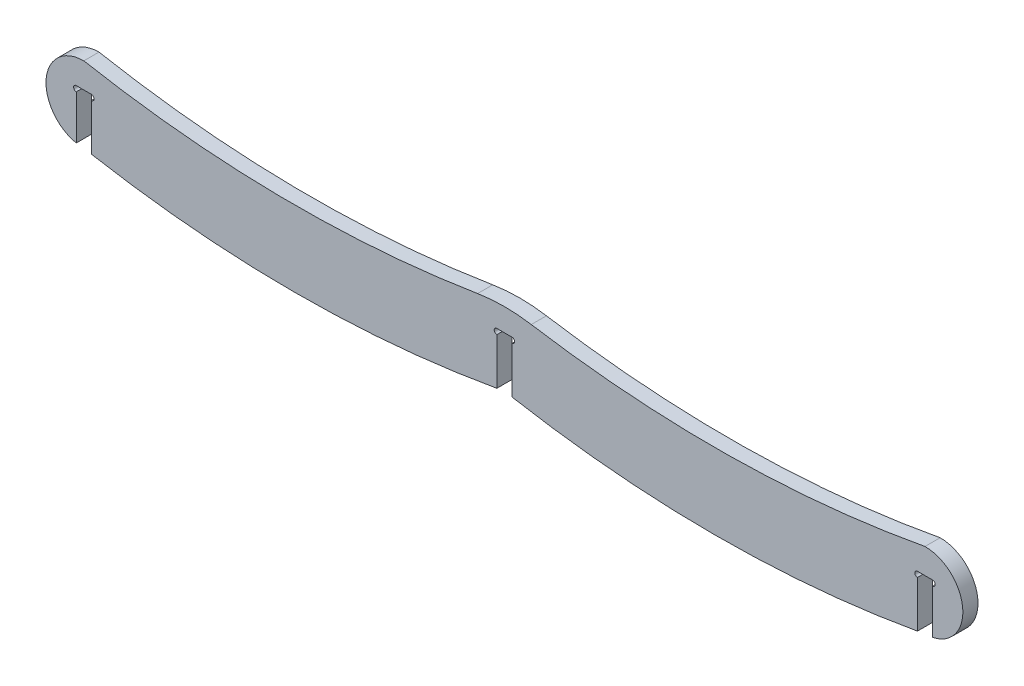
ISO-10303-21;
HEADER;
FILE_DESCRIPTION(('STEP AP214'),'2;1');
FILE_NAME('part.step','',(''),(''),'','','');
FILE_SCHEMA(('AUTOMOTIVE_DESIGN { 1 0 10303 214 1 1 1 1 }'));
ENDSEC;
DATA;
#1=APPLICATION_CONTEXT('core data for automotive mechanical design processes');
#2=APPLICATION_PROTOCOL_DEFINITION('international standard','automotive_design',2000,#1);
#3=PRODUCT_CONTEXT('',#1,'mechanical');
#4=PRODUCT('Part','Part','',(#3));
#5=PRODUCT_RELATED_PRODUCT_CATEGORY('part','',(#4));
#6=PRODUCT_DEFINITION_FORMATION('','',#4);
#7=PRODUCT_DEFINITION_CONTEXT('part definition',#1,'design');
#8=PRODUCT_DEFINITION('design','',#6,#7);
#9=PRODUCT_DEFINITION_SHAPE('','',#8);
#10=(LENGTH_UNIT() NAMED_UNIT(*) SI_UNIT(.MILLI.,.METRE.));
#11=(NAMED_UNIT(*) PLANE_ANGLE_UNIT() SI_UNIT($,.RADIAN.));
#12=(NAMED_UNIT(*) SI_UNIT($,.STERADIAN.) SOLID_ANGLE_UNIT());
#13=UNCERTAINTY_MEASURE_WITH_UNIT(LENGTH_MEASURE(1.E-05),#10,'distance_accuracy_value','');
#14=(GEOMETRIC_REPRESENTATION_CONTEXT(3) GLOBAL_UNCERTAINTY_ASSIGNED_CONTEXT((#13)) GLOBAL_UNIT_ASSIGNED_CONTEXT((#10,
#11,#12)) REPRESENTATION_CONTEXT('',''));
#15=CARTESIAN_POINT('',(0.,0.,0.));
#16=DIRECTION('',(0.,0.,1.));
#17=DIRECTION('',(1.,0.,0.));
#18=AXIS2_PLACEMENT_3D('',#15,#16,#17);
#19=CARTESIAN_POINT('',(192.011086170743,1434.09067760014,18.));
#20=DIRECTION('',(0.,0.,-1.));
#21=DIRECTION('',(-1.,0.,0.));
#22=AXIS2_PLACEMENT_3D('',#19,#20,#21);
#23=CYLINDRICAL_SURFACE('',#22,1367.14291484526);
#24=CARTESIAN_POINT('',(192.011086170743,1434.09067760014,18.));
#25=DIRECTION('',(0.,0.,1.));
#26=DIRECTION('',(1.,0.,0.));
#27=AXIS2_PLACEMENT_3D('',#24,#25,#26);
#28=CIRCLE('',#27,1367.14291484526);
#29=CARTESIAN_POINT('',(-57.9889138292563,90.,18.));
#30=VERTEX_POINT('',#29);
#31=CARTESIAN_POINT('',(410.105891356436,84.4557619423469,18.));
#32=VERTEX_POINT('',#31);
#33=EDGE_CURVE('E186',#30,#32,#28,.T.);
#34=ORIENTED_EDGE('',*,*,#33,.T.);
#35=DIRECTION('',(0.,0.,-1.));
#36=VECTOR('',#35,1.);
#37=CARTESIAN_POINT('',(410.105891356436,84.4557619423467,18.));
#38=LINE('',#37,#36);
#39=CARTESIAN_POINT('',(410.105891356436,84.4557619423469,0.));
#40=VERTEX_POINT('',#39);
#41=EDGE_CURVE('E192',#32,#40,#38,.T.);
#42=ORIENTED_EDGE('',*,*,#41,.T.);
#43=CARTESIAN_POINT('',(192.011086170743,1434.09067760014,0.));
#44=DIRECTION('',(0.,0.,1.));
#45=DIRECTION('',(1.,0.,0.));
#46=AXIS2_PLACEMENT_3D('',#43,#44,#45);
#47=CIRCLE('',#46,1367.14291484526);
#48=CARTESIAN_POINT('',(-57.9889138292563,90.,0.));
#49=VERTEX_POINT('',#48);
#50=EDGE_CURVE('E188',#49,#40,#47,.T.);
#51=ORIENTED_EDGE('',*,*,#50,.F.);
#52=DIRECTION('',(0.,0.,-1.));
#53=VECTOR('',#52,1.);
#54=CARTESIAN_POINT('',(-57.9889138292563,90.,18.));
#55=LINE('',#54,#53);
#56=EDGE_CURVE('E182',#30,#49,#55,.T.);
#57=ORIENTED_EDGE('',*,*,#56,.F.);
#58=EDGE_LOOP('',(#34,#42,#51,#57));
#59=FACE_BOUND('',#58,.T.);
#60=ADVANCED_FACE('F35',(#59),#23,.F.);
#61=CARTESIAN_POINT('',(-57.9889138292565,45.,18.));
#62=DIRECTION('',(0.,0.,-1.));
#63=DIRECTION('',(-1.,0.,0.));
#64=AXIS2_PLACEMENT_3D('',#61,#62,#63);
#65=CYLINDRICAL_SURFACE('',#64,45.);
#66=CARTESIAN_POINT('',(-57.9889138292565,45.,0.));
#67=DIRECTION('',(0.,0.,1.));
#68=DIRECTION('',(1.,0.,0.));
#69=AXIS2_PLACEMENT_3D('',#66,#67,#68);
#70=CIRCLE('',#69,45.);
#71=CARTESIAN_POINT('',(-66.9889138292565,0.909184629902797,0.));
#72=VERTEX_POINT('',#71);
#73=EDGE_CURVE('E258',#49,#72,#70,.T.);
#74=ORIENTED_EDGE('',*,*,#73,.T.);
#75=DIRECTION('',(0.,0.,-1.));
#76=VECTOR('',#75,1.);
#77=CARTESIAN_POINT('',(-66.9889138292565,0.909184629902797,18.));
#78=LINE('',#77,#76);
#79=CARTESIAN_POINT('',(-66.9889138292565,0.909184629902797,18.));
#80=VERTEX_POINT('',#79);
#81=EDGE_CURVE('E193',#80,#72,#78,.T.);
#82=ORIENTED_EDGE('',*,*,#81,.F.);
#83=CARTESIAN_POINT('',(-57.9889138292565,45.,18.));
#84=DIRECTION('',(0.,0.,1.));
#85=DIRECTION('',(1.,0.,0.));
#86=AXIS2_PLACEMENT_3D('',#83,#84,#85);
#87=CIRCLE('',#86,45.);
#88=EDGE_CURVE('E196',#30,#80,#87,.T.);
#89=ORIENTED_EDGE('',*,*,#88,.F.);
#90=ORIENTED_EDGE('',*,*,#56,.T.);
#91=EDGE_LOOP('',(#74,#82,#89,#90));
#92=FACE_BOUND('',#91,.T.);
#93=ADVANCED_FACE('F197',(#92),#65,.T.);
#94=CARTESIAN_POINT('',(-66.9889138292565,0.,18.));
#95=DIRECTION('',(1.,0.,0.));
#96=DIRECTION('',(0.,0.,-1.));
#97=AXIS2_PLACEMENT_3D('',#94,#95,#96);
#98=PLANE('',#97);
#99=DIRECTION('',(0.,-1.,0.));
#100=VECTOR('',#99,1.);
#101=CARTESIAN_POINT('',(-66.9889138292565,0.,0.));
#102=LINE('',#101,#100);
#103=CARTESIAN_POINT('',(-66.9889138292565,53.65,0.));
#104=VERTEX_POINT('',#103);
#105=EDGE_CURVE('E260',#104,#72,#102,.T.);
#106=ORIENTED_EDGE('',*,*,#105,.F.);
#107=DIRECTION('',(0.,0.,-1.));
#108=VECTOR('',#107,1.);
#109=CARTESIAN_POINT('',(-66.9889138292565,53.65,18.));
#110=LINE('',#109,#108);
#111=CARTESIAN_POINT('',(-66.9889138292565,53.65,18.));
#112=VERTEX_POINT('',#111);
#113=EDGE_CURVE('E347',#112,#104,#110,.T.);
#114=ORIENTED_EDGE('',*,*,#113,.F.);
#115=DIRECTION('',(0.,-1.,0.));
#116=VECTOR('',#115,1.);
#117=CARTESIAN_POINT('',(-66.9889138292565,0.,18.));
#118=LINE('',#117,#116);
#119=EDGE_CURVE('E201',#112,#80,#118,.T.);
#120=ORIENTED_EDGE('',*,*,#119,.T.);
#121=ORIENTED_EDGE('',*,*,#81,.T.);
#122=EDGE_LOOP('',(#106,#114,#120,#121));
#123=FACE_BOUND('',#122,.T.);
#124=ADVANCED_FACE('F357',(#123),#98,.T.);
#125=CARTESIAN_POINT('',(-66.9889138292565,56.825,18.));
#126=DIRECTION('',(0.,0.,-1.));
#127=DIRECTION('',(-1.,0.,0.));
#128=AXIS2_PLACEMENT_3D('',#125,#126,#127);
#129=CYLINDRICAL_SURFACE('',#128,3.175);
#130=CARTESIAN_POINT('',(-66.9889138292565,56.825,0.));
#131=DIRECTION('',(0.,0.,1.));
#132=DIRECTION('',(1.,0.,0.));
#133=AXIS2_PLACEMENT_3D('',#130,#131,#132);
#134=CIRCLE('',#133,3.175);
#135=CARTESIAN_POINT('',(-66.9889138292565,60.,0.));
#136=VERTEX_POINT('',#135);
#137=EDGE_CURVE('E263',#136,#104,#134,.T.);
#138=ORIENTED_EDGE('',*,*,#137,.F.);
#139=DIRECTION('',(0.,0.,-1.));
#140=VECTOR('',#139,1.);
#141=CARTESIAN_POINT('',(-66.9889138292565,60.,18.));
#142=LINE('',#141,#140);
#143=CARTESIAN_POINT('',(-66.9889138292565,60.,18.));
#144=VERTEX_POINT('',#143);
#145=EDGE_CURVE('E345',#144,#136,#142,.T.);
#146=ORIENTED_EDGE('',*,*,#145,.F.);
#147=CARTESIAN_POINT('',(-66.9889138292565,56.825,18.));
#148=DIRECTION('',(0.,0.,1.));
#149=DIRECTION('',(1.,0.,0.));
#150=AXIS2_PLACEMENT_3D('',#147,#148,#149);
#151=CIRCLE('',#150,3.175);
#152=EDGE_CURVE('E211',#144,#112,#151,.T.);
#153=ORIENTED_EDGE('',*,*,#152,.T.);
#154=ORIENTED_EDGE('',*,*,#113,.T.);
#155=EDGE_LOOP('',(#138,#146,#153,#154));
#156=FACE_BOUND('',#155,.T.);
#157=ADVANCED_FACE('F360',(#156),#129,.F.);
#158=CARTESIAN_POINT('',(0.,60.,18.));
#159=DIRECTION('',(0.,1.,0.));
#160=DIRECTION('',(0.,0.,1.));
#161=AXIS2_PLACEMENT_3D('',#158,#159,#160);
#162=PLANE('',#161);
#163=DIRECTION('',(1.,0.,0.));
#164=VECTOR('',#163,1.);
#165=CARTESIAN_POINT('',(0.,60.,0.));
#166=LINE('',#165,#164);
#167=CARTESIAN_POINT('',(-48.9889138292565,60.,0.));
#168=VERTEX_POINT('',#167);
#169=EDGE_CURVE('E266',#136,#168,#166,.T.);
#170=ORIENTED_EDGE('',*,*,#169,.T.);
#171=DIRECTION('',(0.,0.,-1.));
#172=VECTOR('',#171,1.);
#173=CARTESIAN_POINT('',(-48.9889138292565,60.,18.));
#174=LINE('',#173,#172);
#175=CARTESIAN_POINT('',(-48.9889138292565,60.,18.));
#176=VERTEX_POINT('',#175);
#177=EDGE_CURVE('E343',#176,#168,#174,.T.);
#178=ORIENTED_EDGE('',*,*,#177,.F.);
#179=DIRECTION('',(1.,0.,0.));
#180=VECTOR('',#179,1.);
#181=CARTESIAN_POINT('',(0.,60.,18.));
#182=LINE('',#181,#180);
#183=EDGE_CURVE('E214',#144,#176,#182,.T.);
#184=ORIENTED_EDGE('',*,*,#183,.F.);
#185=ORIENTED_EDGE('',*,*,#145,.T.);
#186=EDGE_LOOP('',(#170,#178,#184,#185));
#187=FACE_BOUND('',#186,.T.);
#188=ADVANCED_FACE('F364',(#187),#162,.F.);
#189=CARTESIAN_POINT('',(-48.9889138292565,56.825,18.));
#190=DIRECTION('',(0.,0.,-1.));
#191=DIRECTION('',(-1.,0.,0.));
#192=AXIS2_PLACEMENT_3D('',#189,#190,#191);
#193=CYLINDRICAL_SURFACE('',#192,3.175);
#194=CARTESIAN_POINT('',(-48.9889138292565,56.825,0.));
#195=DIRECTION('',(0.,0.,1.));
#196=DIRECTION('',(1.,0.,0.));
#197=AXIS2_PLACEMENT_3D('',#194,#195,#196);
#198=CIRCLE('',#197,3.175);
#199=CARTESIAN_POINT('',(-48.9889138292565,53.65,0.));
#200=VERTEX_POINT('',#199);
#201=EDGE_CURVE('E269',#200,#168,#198,.T.);
#202=ORIENTED_EDGE('',*,*,#201,.F.);
#203=DIRECTION('',(0.,0.,-1.));
#204=VECTOR('',#203,1.);
#205=CARTESIAN_POINT('',(-48.9889138292565,53.65,18.));
#206=LINE('',#205,#204);
#207=CARTESIAN_POINT('',(-48.9889138292565,53.65,18.));
#208=VERTEX_POINT('',#207);
#209=EDGE_CURVE('E341',#208,#200,#206,.T.);
#210=ORIENTED_EDGE('',*,*,#209,.F.);
#211=CARTESIAN_POINT('',(-48.9889138292565,56.825,18.));
#212=DIRECTION('',(0.,0.,1.));
#213=DIRECTION('',(1.,0.,0.));
#214=AXIS2_PLACEMENT_3D('',#211,#212,#213);
#215=CIRCLE('',#214,3.175);
#216=EDGE_CURVE('E216',#208,#176,#215,.T.);
#217=ORIENTED_EDGE('',*,*,#216,.T.);
#218=ORIENTED_EDGE('',*,*,#177,.T.);
#219=EDGE_LOOP('',(#202,#210,#217,#218));
#220=FACE_BOUND('',#219,.T.);
#221=ADVANCED_FACE('F370',(#220),#193,.F.);
#222=CARTESIAN_POINT('',(-48.9889138292565,0.,18.));
#223=DIRECTION('',(1.,0.,0.));
#224=DIRECTION('',(0.,0.,-1.));
#225=AXIS2_PLACEMENT_3D('',#222,#223,#224);
#226=PLANE('',#225);
#227=DIRECTION('',(0.,-1.,0.));
#228=VECTOR('',#227,1.);
#229=CARTESIAN_POINT('',(-48.9889138292565,0.,0.));
#230=LINE('',#229,#228);
#231=CARTESIAN_POINT('',(-48.9889138292565,-1.6428582871113,0.));
#232=VERTEX_POINT('',#231);
#233=EDGE_CURVE('E272',#200,#232,#230,.T.);
#234=ORIENTED_EDGE('',*,*,#233,.T.);
#235=DIRECTION('',(0.,0.,-1.));
#236=VECTOR('',#235,1.);
#237=CARTESIAN_POINT('',(-48.9889138292565,-1.6428582871113,18.));
#238=LINE('',#237,#236);
#239=CARTESIAN_POINT('',(-48.9889138292565,-1.6428582871113,18.));
#240=VERTEX_POINT('',#239);
#241=EDGE_CURVE('E338',#240,#232,#238,.T.);
#242=ORIENTED_EDGE('',*,*,#241,.F.);
#243=DIRECTION('',(0.,-1.,0.));
#244=VECTOR('',#243,1.);
#245=CARTESIAN_POINT('',(-48.9889138292565,0.,18.));
#246=LINE('',#245,#244);
#247=EDGE_CURVE('E219',#208,#240,#246,.T.);
#248=ORIENTED_EDGE('',*,*,#247,.F.);
#249=ORIENTED_EDGE('',*,*,#209,.T.);
#250=EDGE_LOOP('',(#234,#242,#248,#249));
#251=FACE_BOUND('',#250,.T.);
#252=ADVANCED_FACE('F373',(#251),#226,.F.);
#253=CARTESIAN_POINT('',(192.011086170743,1344.09067760014,18.));
#254=DIRECTION('',(0.,0.,-1.));
#255=DIRECTION('',(-1.,0.,0.));
#256=AXIS2_PLACEMENT_3D('',#253,#254,#255);
#257=CYLINDRICAL_SURFACE('',#256,1367.14291484526);
#258=CARTESIAN_POINT('',(192.011086170743,1344.09067760014,0.));
#259=DIRECTION('',(0.,0.,1.));
#260=DIRECTION('',(1.,0.,0.));
#261=AXIS2_PLACEMENT_3D('',#258,#259,#260);
#262=CIRCLE('',#261,1367.14291484526);
#263=CARTESIAN_POINT('',(433.011086170744,-1.6428582871113,0.));
#264=VERTEX_POINT('',#263);
#265=EDGE_CURVE('E274',#232,#264,#262,.T.);
#266=ORIENTED_EDGE('',*,*,#265,.T.);
#267=DIRECTION('',(0.,0.,-1.));
#268=VECTOR('',#267,1.);
#269=CARTESIAN_POINT('',(433.011086170744,-1.6428582871113,18.));
#270=LINE('',#269,#268);
#271=CARTESIAN_POINT('',(433.011086170744,-1.6428582871113,18.));
#272=VERTEX_POINT('',#271);
#273=EDGE_CURVE('E336',#272,#264,#270,.T.);
#274=ORIENTED_EDGE('',*,*,#273,.F.);
#275=CARTESIAN_POINT('',(192.011086170743,1344.09067760014,18.));
#276=DIRECTION('',(0.,0.,1.));
#277=DIRECTION('',(1.,0.,0.));
#278=AXIS2_PLACEMENT_3D('',#275,#276,#277);
#279=CIRCLE('',#278,1367.14291484526);
#280=EDGE_CURVE('E221',#240,#272,#279,.T.);
#281=ORIENTED_EDGE('',*,*,#280,.F.);
#282=ORIENTED_EDGE('',*,*,#241,.T.);
#283=EDGE_LOOP('',(#266,#274,#281,#282));
#284=FACE_BOUND('',#283,.T.);
#285=ADVANCED_FACE('F378',(#284),#257,.T.);
#286=CARTESIAN_POINT('',(433.011086170744,0.,18.));
#287=DIRECTION('',(1.,0.,0.));
#288=DIRECTION('',(0.,0.,-1.));
#289=AXIS2_PLACEMENT_3D('',#286,#287,#288);
#290=PLANE('',#289);
#291=DIRECTION('',(0.,-1.,0.));
#292=VECTOR('',#291,1.);
#293=CARTESIAN_POINT('',(433.011086170744,0.,0.));
#294=LINE('',#293,#292);
#295=CARTESIAN_POINT('',(433.011086170744,53.6500000000001,0.));
#296=VERTEX_POINT('',#295);
#297=EDGE_CURVE('E277',#296,#264,#294,.T.);
#298=ORIENTED_EDGE('',*,*,#297,.F.);
#299=DIRECTION('',(0.,0.,-1.));
#300=VECTOR('',#299,1.);
#301=CARTESIAN_POINT('',(433.011086170744,53.6500000000001,18.));
#302=LINE('',#301,#300);
#303=CARTESIAN_POINT('',(433.011086170744,53.6500000000001,18.));
#304=VERTEX_POINT('',#303);
#305=EDGE_CURVE('E334',#304,#296,#302,.T.);
#306=ORIENTED_EDGE('',*,*,#305,.F.);
#307=DIRECTION('',(0.,-1.,0.));
#308=VECTOR('',#307,1.);
#309=CARTESIAN_POINT('',(433.011086170744,0.,18.));
#310=LINE('',#309,#308);
#311=EDGE_CURVE('E223',#304,#272,#310,.T.);
#312=ORIENTED_EDGE('',*,*,#311,.T.);
#313=ORIENTED_EDGE('',*,*,#273,.T.);
#314=EDGE_LOOP('',(#298,#306,#312,#313));
#315=FACE_BOUND('',#314,.T.);
#316=ADVANCED_FACE('F454',(#315),#290,.T.);
#317=CARTESIAN_POINT('',(433.011086170744,56.8250000000001,18.));
#318=DIRECTION('',(0.,0.,-1.));
#319=DIRECTION('',(-1.,0.,0.));
#320=AXIS2_PLACEMENT_3D('',#317,#318,#319);
#321=CYLINDRICAL_SURFACE('',#320,3.175);
#322=CARTESIAN_POINT('',(433.011086170744,56.8250000000001,0.));
#323=DIRECTION('',(0.,0.,1.));
#324=DIRECTION('',(1.,0.,0.));
#325=AXIS2_PLACEMENT_3D('',#322,#323,#324);
#326=CIRCLE('',#325,3.175);
#327=CARTESIAN_POINT('',(433.011086170744,60.0000000000001,0.));
#328=VERTEX_POINT('',#327);
#329=EDGE_CURVE('E280',#328,#296,#326,.T.);
#330=ORIENTED_EDGE('',*,*,#329,.F.);
#331=DIRECTION('',(0.,0.,-1.));
#332=VECTOR('',#331,1.);
#333=CARTESIAN_POINT('',(433.011086170744,60.0000000000001,18.));
#334=LINE('',#333,#332);
#335=CARTESIAN_POINT('',(433.011086170744,60.0000000000001,18.));
#336=VERTEX_POINT('',#335);
#337=EDGE_CURVE('E332',#336,#328,#334,.T.);
#338=ORIENTED_EDGE('',*,*,#337,.F.);
#339=CARTESIAN_POINT('',(433.011086170744,56.8250000000001,18.));
#340=DIRECTION('',(0.,0.,1.));
#341=DIRECTION('',(1.,0.,0.));
#342=AXIS2_PLACEMENT_3D('',#339,#340,#341);
#343=CIRCLE('',#342,3.175);
#344=EDGE_CURVE('E226',#336,#304,#343,.T.);
#345=ORIENTED_EDGE('',*,*,#344,.T.);
#346=ORIENTED_EDGE('',*,*,#305,.T.);
#347=EDGE_LOOP('',(#330,#338,#345,#346));
#348=FACE_BOUND('',#347,.T.);
#349=ADVANCED_FACE('F384',(#348),#321,.F.);
#350=CARTESIAN_POINT('',(0.,60.0000000000001,18.));
#351=DIRECTION('',(0.,1.,0.));
#352=DIRECTION('',(0.,0.,1.));
#353=AXIS2_PLACEMENT_3D('',#350,#351,#352);
#354=PLANE('',#353);
#355=DIRECTION('',(1.,0.,0.));
#356=VECTOR('',#355,1.);
#357=CARTESIAN_POINT('',(0.,60.0000000000001,0.));
#358=LINE('',#357,#356);
#359=CARTESIAN_POINT('',(451.011086170743,60.0000000000001,0.));
#360=VERTEX_POINT('',#359);
#361=EDGE_CURVE('E283',#328,#360,#358,.T.);
#362=ORIENTED_EDGE('',*,*,#361,.T.);
#363=DIRECTION('',(0.,0.,-1.));
#364=VECTOR('',#363,1.);
#365=CARTESIAN_POINT('',(451.011086170743,60.0000000000001,18.));
#366=LINE('',#365,#364);
#367=CARTESIAN_POINT('',(451.011086170743,60.0000000000001,18.));
#368=VERTEX_POINT('',#367);
#369=EDGE_CURVE('E330',#368,#360,#366,.T.);
#370=ORIENTED_EDGE('',*,*,#369,.F.);
#371=DIRECTION('',(1.,0.,0.));
#372=VECTOR('',#371,1.);
#373=CARTESIAN_POINT('',(0.,60.0000000000001,18.));
#374=LINE('',#373,#372);
#375=EDGE_CURVE('E229',#336,#368,#374,.T.);
#376=ORIENTED_EDGE('',*,*,#375,.F.);
#377=ORIENTED_EDGE('',*,*,#337,.T.);
#378=EDGE_LOOP('',(#362,#370,#376,#377));
#379=FACE_BOUND('',#378,.T.);
#380=ADVANCED_FACE('F390',(#379),#354,.F.);
#381=CARTESIAN_POINT('',(451.011086170743,56.8250000000001,18.));
#382=DIRECTION('',(0.,0.,-1.));
#383=DIRECTION('',(-1.,0.,0.));
#384=AXIS2_PLACEMENT_3D('',#381,#382,#383);
#385=CYLINDRICAL_SURFACE('',#384,3.175);
#386=CARTESIAN_POINT('',(451.011086170743,56.8250000000001,0.));
#387=DIRECTION('',(0.,0.,1.));
#388=DIRECTION('',(1.,0.,0.));
#389=AXIS2_PLACEMENT_3D('',#386,#387,#388);
#390=CIRCLE('',#389,3.175);
#391=CARTESIAN_POINT('',(451.011086170743,53.6500000000001,0.));
#392=VERTEX_POINT('',#391);
#393=EDGE_CURVE('E286',#392,#360,#390,.T.);
#394=ORIENTED_EDGE('',*,*,#393,.F.);
#395=DIRECTION('',(0.,0.,-1.));
#396=VECTOR('',#395,1.);
#397=CARTESIAN_POINT('',(451.011086170743,53.6500000000001,18.));
#398=LINE('',#397,#396);
#399=CARTESIAN_POINT('',(451.011086170743,53.6500000000001,18.));
#400=VERTEX_POINT('',#399);
#401=EDGE_CURVE('E328',#400,#392,#398,.T.);
#402=ORIENTED_EDGE('',*,*,#401,.F.);
#403=CARTESIAN_POINT('',(451.011086170743,56.8250000000001,18.));
#404=DIRECTION('',(0.,0.,1.));
#405=DIRECTION('',(1.,0.,0.));
#406=AXIS2_PLACEMENT_3D('',#403,#404,#405);
#407=CIRCLE('',#406,3.175);
#408=EDGE_CURVE('E231',#400,#368,#407,.T.);
#409=ORIENTED_EDGE('',*,*,#408,.T.);
#410=ORIENTED_EDGE('',*,*,#369,.T.);
#411=EDGE_LOOP('',(#394,#402,#409,#410));
#412=FACE_BOUND('',#411,.T.);
#413=ADVANCED_FACE('F396',(#412),#385,.F.);
#414=CARTESIAN_POINT('',(451.011086170743,0.,18.));
#415=DIRECTION('',(1.,0.,0.));
#416=DIRECTION('',(0.,0.,-1.));
#417=AXIS2_PLACEMENT_3D('',#414,#415,#416);
#418=PLANE('',#417);
#419=DIRECTION('',(0.,-1.,0.));
#420=VECTOR('',#419,1.);
#421=CARTESIAN_POINT('',(451.011086170743,0.,0.));
#422=LINE('',#421,#420);
#423=CARTESIAN_POINT('',(451.011086170743,-1.6428582871113,0.));
#424=VERTEX_POINT('',#423);
#425=EDGE_CURVE('E289',#392,#424,#422,.T.);
#426=ORIENTED_EDGE('',*,*,#425,.T.);
#427=DIRECTION('',(0.,0.,-1.));
#428=VECTOR('',#427,1.);
#429=CARTESIAN_POINT('',(451.011086170743,-1.6428582871113,18.));
#430=LINE('',#429,#428);
#431=CARTESIAN_POINT('',(451.011086170743,-1.6428582871113,18.));
#432=VERTEX_POINT('',#431);
#433=EDGE_CURVE('E325',#432,#424,#430,.T.);
#434=ORIENTED_EDGE('',*,*,#433,.F.);
#435=DIRECTION('',(0.,-1.,0.));
#436=VECTOR('',#435,1.);
#437=CARTESIAN_POINT('',(451.011086170743,0.,18.));
#438=LINE('',#437,#436);
#439=EDGE_CURVE('E234',#400,#432,#438,.T.);
#440=ORIENTED_EDGE('',*,*,#439,.F.);
#441=ORIENTED_EDGE('',*,*,#401,.T.);
#442=EDGE_LOOP('',(#426,#434,#440,#441));
#443=FACE_BOUND('',#442,.T.);
#444=ADVANCED_FACE('F399',(#443),#418,.F.);
#445=CARTESIAN_POINT('',(692.011086170743,1344.09067760014,18.));
#446=DIRECTION('',(0.,0.,-1.));
#447=DIRECTION('',(-1.,0.,0.));
#448=AXIS2_PLACEMENT_3D('',#445,#446,#447);
#449=CYLINDRICAL_SURFACE('',#448,1367.14291484526);
#450=CARTESIAN_POINT('',(692.011086170743,1344.09067760014,0.));
#451=DIRECTION('',(0.,0.,1.));
#452=DIRECTION('',(1.,0.,0.));
#453=AXIS2_PLACEMENT_3D('',#450,#451,#452);
#454=CIRCLE('',#453,1367.14291484526);
#455=CARTESIAN_POINT('',(933.011086170744,-1.6428582871113,0.));
#456=VERTEX_POINT('',#455);
#457=EDGE_CURVE('E291',#424,#456,#454,.T.);
#458=ORIENTED_EDGE('',*,*,#457,.T.);
#459=DIRECTION('',(0.,0.,-1.));
#460=VECTOR('',#459,1.);
#461=CARTESIAN_POINT('',(933.011086170744,-1.6428582871113,18.));
#462=LINE('',#461,#460);
#463=CARTESIAN_POINT('',(933.011086170744,-1.6428582871113,18.));
#464=VERTEX_POINT('',#463);
#465=EDGE_CURVE('E323',#464,#456,#462,.T.);
#466=ORIENTED_EDGE('',*,*,#465,.F.);
#467=CARTESIAN_POINT('',(692.011086170743,1344.09067760014,18.));
#468=DIRECTION('',(0.,0.,1.));
#469=DIRECTION('',(1.,0.,0.));
#470=AXIS2_PLACEMENT_3D('',#467,#468,#469);
#471=CIRCLE('',#470,1367.14291484526);
#472=EDGE_CURVE('E236',#432,#464,#471,.T.);
#473=ORIENTED_EDGE('',*,*,#472,.F.);
#474=ORIENTED_EDGE('',*,*,#433,.T.);
#475=EDGE_LOOP('',(#458,#466,#473,#474));
#476=FACE_BOUND('',#475,.T.);
#477=ADVANCED_FACE('F404',(#476),#449,.T.);
#478=CARTESIAN_POINT('',(933.011086170744,0.,18.));
#479=DIRECTION('',(1.,0.,0.));
#480=DIRECTION('',(0.,0.,-1.));
#481=AXIS2_PLACEMENT_3D('',#478,#479,#480);
#482=PLANE('',#481);
#483=DIRECTION('',(0.,-1.,0.));
#484=VECTOR('',#483,1.);
#485=CARTESIAN_POINT('',(933.011086170744,0.,0.));
#486=LINE('',#485,#484);
#487=CARTESIAN_POINT('',(933.011086170744,53.6499999999999,0.));
#488=VERTEX_POINT('',#487);
#489=EDGE_CURVE('E294',#488,#456,#486,.T.);
#490=ORIENTED_EDGE('',*,*,#489,.F.);
#491=DIRECTION('',(0.,0.,-1.));
#492=VECTOR('',#491,1.);
#493=CARTESIAN_POINT('',(933.011086170744,53.6499999999999,18.));
#494=LINE('',#493,#492);
#495=CARTESIAN_POINT('',(933.011086170744,53.6499999999999,18.));
#496=VERTEX_POINT('',#495);
#497=EDGE_CURVE('E321',#496,#488,#494,.T.);
#498=ORIENTED_EDGE('',*,*,#497,.F.);
#499=DIRECTION('',(0.,-1.,0.));
#500=VECTOR('',#499,1.);
#501=CARTESIAN_POINT('',(933.011086170744,0.,18.));
#502=LINE('',#501,#500);
#503=EDGE_CURVE('E238',#496,#464,#502,.T.);
#504=ORIENTED_EDGE('',*,*,#503,.T.);
#505=ORIENTED_EDGE('',*,*,#465,.T.);
#506=EDGE_LOOP('',(#490,#498,#504,#505));
#507=FACE_BOUND('',#506,.T.);
#508=ADVANCED_FACE('F467',(#507),#482,.T.);
#509=CARTESIAN_POINT('',(933.011086170744,56.8249999999999,18.));
#510=DIRECTION('',(0.,0.,-1.));
#511=DIRECTION('',(-1.,0.,0.));
#512=AXIS2_PLACEMENT_3D('',#509,#510,#511);
#513=CYLINDRICAL_SURFACE('',#512,3.175);
#514=CARTESIAN_POINT('',(933.011086170744,56.8249999999999,0.));
#515=DIRECTION('',(0.,0.,1.));
#516=DIRECTION('',(1.,0.,0.));
#517=AXIS2_PLACEMENT_3D('',#514,#515,#516);
#518=CIRCLE('',#517,3.175);
#519=CARTESIAN_POINT('',(933.011086170744,59.9999999999999,0.));
#520=VERTEX_POINT('',#519);
#521=EDGE_CURVE('E297',#520,#488,#518,.T.);
#522=ORIENTED_EDGE('',*,*,#521,.F.);
#523=DIRECTION('',(0.,0.,-1.));
#524=VECTOR('',#523,1.);
#525=CARTESIAN_POINT('',(933.011086170744,59.9999999999999,18.));
#526=LINE('',#525,#524);
#527=CARTESIAN_POINT('',(933.011086170744,59.9999999999999,18.));
#528=VERTEX_POINT('',#527);
#529=EDGE_CURVE('E319',#528,#520,#526,.T.);
#530=ORIENTED_EDGE('',*,*,#529,.F.);
#531=CARTESIAN_POINT('',(933.011086170744,56.8249999999999,18.));
#532=DIRECTION('',(0.,0.,1.));
#533=DIRECTION('',(1.,0.,0.));
#534=AXIS2_PLACEMENT_3D('',#531,#532,#533);
#535=CIRCLE('',#534,3.175);
#536=EDGE_CURVE('E241',#528,#496,#535,.T.);
#537=ORIENTED_EDGE('',*,*,#536,.T.);
#538=ORIENTED_EDGE('',*,*,#497,.T.);
#539=EDGE_LOOP('',(#522,#530,#537,#538));
#540=FACE_BOUND('',#539,.T.);
#541=ADVANCED_FACE('F410',(#540),#513,.F.);
#542=CARTESIAN_POINT('',(0.,59.9999999999999,18.));
#543=DIRECTION('',(0.,1.,0.));
#544=DIRECTION('',(0.,0.,1.));
#545=AXIS2_PLACEMENT_3D('',#542,#543,#544);
#546=PLANE('',#545);
#547=DIRECTION('',(1.,0.,0.));
#548=VECTOR('',#547,1.);
#549=CARTESIAN_POINT('',(0.,59.9999999999999,0.));
#550=LINE('',#549,#548);
#551=CARTESIAN_POINT('',(951.011086170743,59.9999999999999,0.));
#552=VERTEX_POINT('',#551);
#553=EDGE_CURVE('E300',#520,#552,#550,.T.);
#554=ORIENTED_EDGE('',*,*,#553,.T.);
#555=DIRECTION('',(0.,0.,-1.));
#556=VECTOR('',#555,1.);
#557=CARTESIAN_POINT('',(951.011086170743,59.9999999999999,18.));
#558=LINE('',#557,#556);
#559=CARTESIAN_POINT('',(951.011086170743,59.9999999999999,18.));
#560=VERTEX_POINT('',#559);
#561=EDGE_CURVE('E317',#560,#552,#558,.T.);
#562=ORIENTED_EDGE('',*,*,#561,.F.);
#563=DIRECTION('',(1.,0.,0.));
#564=VECTOR('',#563,1.);
#565=CARTESIAN_POINT('',(0.,59.9999999999999,18.));
#566=LINE('',#565,#564);
#567=EDGE_CURVE('E244',#528,#560,#566,.T.);
#568=ORIENTED_EDGE('',*,*,#567,.F.);
#569=ORIENTED_EDGE('',*,*,#529,.T.);
#570=EDGE_LOOP('',(#554,#562,#568,#569));
#571=FACE_BOUND('',#570,.T.);
#572=ADVANCED_FACE('F416',(#571),#546,.F.);
#573=CARTESIAN_POINT('',(951.011086170743,56.8249999999999,18.));
#574=DIRECTION('',(0.,0.,-1.));
#575=DIRECTION('',(-1.,0.,0.));
#576=AXIS2_PLACEMENT_3D('',#573,#574,#575);
#577=CYLINDRICAL_SURFACE('',#576,3.175);
#578=CARTESIAN_POINT('',(951.011086170743,56.8249999999999,0.));
#579=DIRECTION('',(0.,0.,1.));
#580=DIRECTION('',(1.,0.,0.));
#581=AXIS2_PLACEMENT_3D('',#578,#579,#580);
#582=CIRCLE('',#581,3.175);
#583=CARTESIAN_POINT('',(951.011086170743,53.6499999999999,0.));
#584=VERTEX_POINT('',#583);
#585=EDGE_CURVE('E303',#584,#552,#582,.T.);
#586=ORIENTED_EDGE('',*,*,#585,.F.);
#587=DIRECTION('',(0.,0.,-1.));
#588=VECTOR('',#587,1.);
#589=CARTESIAN_POINT('',(951.011086170743,53.6499999999999,18.));
#590=LINE('',#589,#588);
#591=CARTESIAN_POINT('',(951.011086170743,53.6499999999999,18.));
#592=VERTEX_POINT('',#591);
#593=EDGE_CURVE('E315',#592,#584,#590,.T.);
#594=ORIENTED_EDGE('',*,*,#593,.F.);
#595=CARTESIAN_POINT('',(951.011086170743,56.8249999999999,18.));
#596=DIRECTION('',(0.,0.,1.));
#597=DIRECTION('',(1.,0.,0.));
#598=AXIS2_PLACEMENT_3D('',#595,#596,#597);
#599=CIRCLE('',#598,3.175);
#600=EDGE_CURVE('E246',#592,#560,#599,.T.);
#601=ORIENTED_EDGE('',*,*,#600,.T.);
#602=ORIENTED_EDGE('',*,*,#561,.T.);
#603=EDGE_LOOP('',(#586,#594,#601,#602));
#604=FACE_BOUND('',#603,.T.);
#605=ADVANCED_FACE('F422',(#604),#577,.F.);
#606=CARTESIAN_POINT('',(951.011086170743,0.,18.));
#607=DIRECTION('',(1.,0.,0.));
#608=DIRECTION('',(0.,0.,-1.));
#609=AXIS2_PLACEMENT_3D('',#606,#607,#608);
#610=PLANE('',#609);
#611=DIRECTION('',(0.,-1.,0.));
#612=VECTOR('',#611,1.);
#613=CARTESIAN_POINT('',(951.011086170743,0.,0.));
#614=LINE('',#613,#612);
#615=CARTESIAN_POINT('',(951.011086170743,0.909184629902561,0.));
#616=VERTEX_POINT('',#615);
#617=EDGE_CURVE('E306',#584,#616,#614,.T.);
#618=ORIENTED_EDGE('',*,*,#617,.T.);
#619=DIRECTION('',(0.,0.,-1.));
#620=VECTOR('',#619,1.);
#621=CARTESIAN_POINT('',(951.011086170743,0.909184629902561,18.));
#622=LINE('',#621,#620);
#623=CARTESIAN_POINT('',(951.011086170743,0.909184629902561,18.));
#624=VERTEX_POINT('',#623);
#625=EDGE_CURVE('E312',#624,#616,#622,.T.);
#626=ORIENTED_EDGE('',*,*,#625,.F.);
#627=DIRECTION('',(0.,-1.,0.));
#628=VECTOR('',#627,1.);
#629=CARTESIAN_POINT('',(951.011086170743,0.,18.));
#630=LINE('',#629,#628);
#631=EDGE_CURVE('E249',#592,#624,#630,.T.);
#632=ORIENTED_EDGE('',*,*,#631,.F.);
#633=ORIENTED_EDGE('',*,*,#593,.T.);
#634=EDGE_LOOP('',(#618,#626,#632,#633));
#635=FACE_BOUND('',#634,.T.);
#636=ADVANCED_FACE('F425',(#635),#610,.F.);
#637=CARTESIAN_POINT('',(942.011086170744,44.9999999999999,18.));
#638=DIRECTION('',(0.,0.,-1.));
#639=DIRECTION('',(-1.,0.,0.));
#640=AXIS2_PLACEMENT_3D('',#637,#638,#639);
#641=CYLINDRICAL_SURFACE('',#640,45.0000000000001);
#642=CARTESIAN_POINT('',(942.011086170744,44.9999999999999,0.));
#643=DIRECTION('',(0.,0.,1.));
#644=DIRECTION('',(1.,0.,0.));
#645=AXIS2_PLACEMENT_3D('',#642,#643,#644);
#646=CIRCLE('',#645,45.0000000000001);
#647=CARTESIAN_POINT('',(942.011086170744,89.9999999999999,0.));
#648=VERTEX_POINT('',#647);
#649=EDGE_CURVE('E207',#616,#648,#646,.T.);
#650=ORIENTED_EDGE('',*,*,#649,.T.);
#651=DIRECTION('',(0.,0.,-1.));
#652=VECTOR('',#651,1.);
#653=CARTESIAN_POINT('',(942.011086170744,89.9999999999999,18.));
#654=LINE('',#653,#652);
#655=CARTESIAN_POINT('',(942.011086170744,89.9999999999999,18.));
#656=VERTEX_POINT('',#655);
#657=EDGE_CURVE('E256',#656,#648,#654,.T.);
#658=ORIENTED_EDGE('',*,*,#657,.F.);
#659=CARTESIAN_POINT('',(942.011086170744,44.9999999999999,18.));
#660=DIRECTION('',(0.,0.,1.));
#661=DIRECTION('',(1.,0.,0.));
#662=AXIS2_PLACEMENT_3D('',#659,#660,#661);
#663=CIRCLE('',#662,45.0000000000001);
#664=EDGE_CURVE('E251',#624,#656,#663,.T.);
#665=ORIENTED_EDGE('',*,*,#664,.F.);
#666=ORIENTED_EDGE('',*,*,#625,.T.);
#667=EDGE_LOOP('',(#650,#658,#665,#666));
#668=FACE_BOUND('',#667,.T.);
#669=ADVANCED_FACE('F430',(#668),#641,.T.);
#670=CARTESIAN_POINT('',(692.011086170743,1434.09067760014,18.));
#671=DIRECTION('',(0.,0.,-1.));
#672=DIRECTION('',(-1.,0.,0.));
#673=AXIS2_PLACEMENT_3D('',#670,#671,#672);
#674=CYLINDRICAL_SURFACE('',#673,1367.14291484526);
#675=CARTESIAN_POINT('',(692.011086170743,1434.09067760014,0.));
#676=DIRECTION('',(0.,0.,1.));
#677=DIRECTION('',(1.,0.,0.));
#678=AXIS2_PLACEMENT_3D('',#675,#676,#677);
#679=CIRCLE('',#678,1367.14291484526);
#680=CARTESIAN_POINT('',(473.916280985051,84.4557619423469,0.));
#681=VERTEX_POINT('',#680);
#682=EDGE_CURVE('E205',#681,#648,#679,.T.);
#683=ORIENTED_EDGE('',*,*,#682,.F.);
#684=DIRECTION('',(0.,0.,-1.));
#685=VECTOR('',#684,1.);
#686=CARTESIAN_POINT('',(473.916280985051,84.4557619423467,18.));
#687=LINE('',#686,#685);
#688=CARTESIAN_POINT('',(473.916280985051,84.4557619423469,18.));
#689=VERTEX_POINT('',#688);
#690=EDGE_CURVE('E43',#681,#689,#687,.F.);
#691=ORIENTED_EDGE('',*,*,#690,.T.);
#692=CARTESIAN_POINT('',(692.011086170743,1434.09067760014,18.));
#693=DIRECTION('',(0.,0.,1.));
#694=DIRECTION('',(1.,0.,0.));
#695=AXIS2_PLACEMENT_3D('',#692,#693,#694);
#696=CIRCLE('',#695,1367.14291484526);
#697=EDGE_CURVE('E254',#689,#656,#696,.T.);
#698=ORIENTED_EDGE('',*,*,#697,.T.);
#699=ORIENTED_EDGE('',*,*,#657,.T.);
#700=EDGE_LOOP('',(#683,#691,#698,#699));
#701=FACE_BOUND('',#700,.T.);
#702=ADVANCED_FACE('F480',(#701),#674,.F.);
#703=CARTESIAN_POINT('',(0.,0.,18.));
#704=DIRECTION('',(0.,0.,1.));
#705=DIRECTION('',(1.,0.,0.));
#706=AXIS2_PLACEMENT_3D('',#703,#704,#705);
#707=PLANE('',#706);
#708=ORIENTED_EDGE('',*,*,#697,.F.);
#709=CARTESIAN_POINT('',(442.011086170743,-112.982984366125,18.));
#710=DIRECTION('',(0.,0.,1.));
#711=DIRECTION('',(1.,0.,0.));
#712=AXIS2_PLACEMENT_3D('',#709,#710,#711);
#713=CIRCLE('',#712,200.);
#714=EDGE_CURVE('E11',#689,#32,#713,.T.);
#715=ORIENTED_EDGE('',*,*,#714,.T.);
#716=ORIENTED_EDGE('',*,*,#33,.F.);
#717=ORIENTED_EDGE('',*,*,#88,.T.);
#718=ORIENTED_EDGE('',*,*,#119,.F.);
#719=ORIENTED_EDGE('',*,*,#152,.F.);
#720=ORIENTED_EDGE('',*,*,#183,.T.);
#721=ORIENTED_EDGE('',*,*,#216,.F.);
#722=ORIENTED_EDGE('',*,*,#247,.T.);
#723=ORIENTED_EDGE('',*,*,#280,.T.);
#724=ORIENTED_EDGE('',*,*,#311,.F.);
#725=ORIENTED_EDGE('',*,*,#344,.F.);
#726=ORIENTED_EDGE('',*,*,#375,.T.);
#727=ORIENTED_EDGE('',*,*,#408,.F.);
#728=ORIENTED_EDGE('',*,*,#439,.T.);
#729=ORIENTED_EDGE('',*,*,#472,.T.);
#730=ORIENTED_EDGE('',*,*,#503,.F.);
#731=ORIENTED_EDGE('',*,*,#536,.F.);
#732=ORIENTED_EDGE('',*,*,#567,.T.);
#733=ORIENTED_EDGE('',*,*,#600,.F.);
#734=ORIENTED_EDGE('',*,*,#631,.T.);
#735=ORIENTED_EDGE('',*,*,#664,.T.);
#736=EDGE_LOOP('',(#708,#715,#716,#717,#718,#719,#720,#721,#722,#723,#724,#725,#726,#727,#728,
#729,#730,#731,#732,#733,#734,#735));
#737=FACE_BOUND('',#736,.T.);
#738=ADVANCED_FACE('F203',(#737),#707,.T.);
#739=CARTESIAN_POINT('',(0.,0.,0.));
#740=DIRECTION('',(0.,0.,1.));
#741=DIRECTION('',(1.,0.,0.));
#742=AXIS2_PLACEMENT_3D('',#739,#740,#741);
#743=PLANE('',#742);
#744=ORIENTED_EDGE('',*,*,#50,.T.);
#745=CARTESIAN_POINT('',(442.011086170743,-112.982984366125,0.));
#746=DIRECTION('',(0.,0.,1.));
#747=DIRECTION('',(1.,0.,0.));
#748=AXIS2_PLACEMENT_3D('',#745,#746,#747);
#749=CIRCLE('',#748,200.);
#750=EDGE_CURVE('E57',#40,#681,#749,.F.);
#751=ORIENTED_EDGE('',*,*,#750,.T.);
#752=ORIENTED_EDGE('',*,*,#682,.T.);
#753=ORIENTED_EDGE('',*,*,#649,.F.);
#754=ORIENTED_EDGE('',*,*,#617,.F.);
#755=ORIENTED_EDGE('',*,*,#585,.T.);
#756=ORIENTED_EDGE('',*,*,#553,.F.);
#757=ORIENTED_EDGE('',*,*,#521,.T.);
#758=ORIENTED_EDGE('',*,*,#489,.T.);
#759=ORIENTED_EDGE('',*,*,#457,.F.);
#760=ORIENTED_EDGE('',*,*,#425,.F.);
#761=ORIENTED_EDGE('',*,*,#393,.T.);
#762=ORIENTED_EDGE('',*,*,#361,.F.);
#763=ORIENTED_EDGE('',*,*,#329,.T.);
#764=ORIENTED_EDGE('',*,*,#297,.T.);
#765=ORIENTED_EDGE('',*,*,#265,.F.);
#766=ORIENTED_EDGE('',*,*,#233,.F.);
#767=ORIENTED_EDGE('',*,*,#201,.T.);
#768=ORIENTED_EDGE('',*,*,#169,.F.);
#769=ORIENTED_EDGE('',*,*,#137,.T.);
#770=ORIENTED_EDGE('',*,*,#105,.T.);
#771=ORIENTED_EDGE('',*,*,#73,.F.);
#772=EDGE_LOOP('',(#744,#751,#752,#753,#754,#755,#756,#757,#758,#759,#760,#761,#762,#763,#764,
#765,#766,#767,#768,#769,#770,#771));
#773=FACE_BOUND('',#772,.T.);
#774=ADVANCED_FACE('F352',(#773),#743,.F.);
#775=CARTESIAN_POINT('',(442.011086170743,-112.982984366125,18.));
#776=DIRECTION('',(0.,0.,-1.));
#777=DIRECTION('',(-1.,0.,0.));
#778=AXIS2_PLACEMENT_3D('',#775,#776,#777);
#779=CYLINDRICAL_SURFACE('',#778,200.);
#780=ORIENTED_EDGE('',*,*,#714,.F.);
#781=ORIENTED_EDGE('',*,*,#690,.F.);
#782=ORIENTED_EDGE('',*,*,#750,.F.);
#783=ORIENTED_EDGE('',*,*,#41,.F.);
#784=EDGE_LOOP('',(#780,#781,#782,#783));
#785=FACE_BOUND('',#784,.T.);
#786=ADVANCED_FACE('F37',(#785),#779,.T.);
#787=CLOSED_SHELL('',(#60,#93,#124,#157,#188,#221,#252,#285,#316,#349,#380,#413,#444,#477,#508,
#541,#572,#605,#636,#669,#702,#738,#774,#786));
#788=MANIFOLD_SOLID_BREP('B2',#787);
#789=ADVANCED_BREP_SHAPE_REPRESENTATION('',(#18,#788),#14);
#790=SHAPE_DEFINITION_REPRESENTATION(#9,#789);
ENDSEC;
END-ISO-10303-21;
